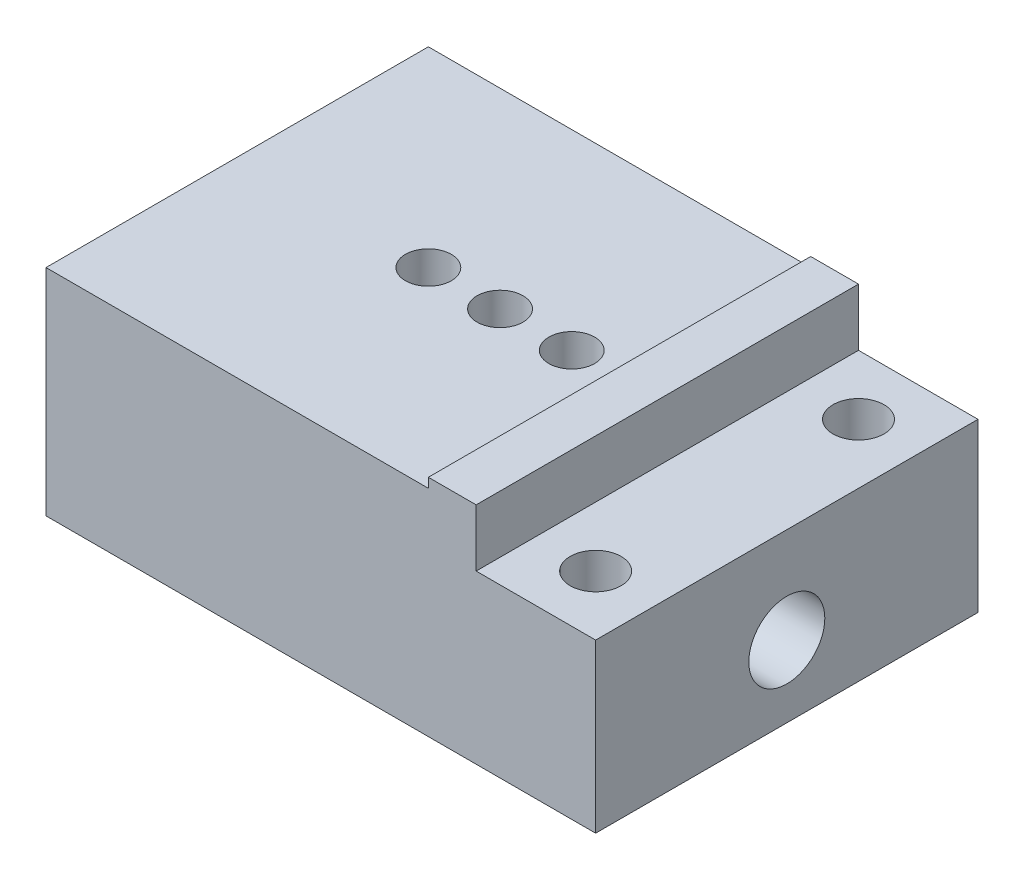
ISO-10303-21;
HEADER;
FILE_DESCRIPTION(('STEP AP214'),'2;1');
FILE_NAME('part.step','',(''),(''),'','','');
FILE_SCHEMA(('AUTOMOTIVE_DESIGN { 1 0 10303 214 1 1 1 1 }'));
ENDSEC;
DATA;
#1=APPLICATION_CONTEXT('core data for automotive mechanical design processes');
#2=APPLICATION_PROTOCOL_DEFINITION('international standard','automotive_design',2000,#1);
#3=PRODUCT_CONTEXT('',#1,'mechanical');
#4=PRODUCT('Part','Part','',(#3));
#5=PRODUCT_RELATED_PRODUCT_CATEGORY('part','',(#4));
#6=PRODUCT_DEFINITION_FORMATION('','',#4);
#7=PRODUCT_DEFINITION_CONTEXT('part definition',#1,'design');
#8=PRODUCT_DEFINITION('design','',#6,#7);
#9=PRODUCT_DEFINITION_SHAPE('','',#8);
#10=(LENGTH_UNIT() NAMED_UNIT(*) SI_UNIT(.MILLI.,.METRE.));
#11=(NAMED_UNIT(*) PLANE_ANGLE_UNIT() SI_UNIT($,.RADIAN.));
#12=(NAMED_UNIT(*) SI_UNIT($,.STERADIAN.) SOLID_ANGLE_UNIT());
#13=UNCERTAINTY_MEASURE_WITH_UNIT(LENGTH_MEASURE(1.E-05),#10,'distance_accuracy_value','');
#14=(GEOMETRIC_REPRESENTATION_CONTEXT(3) GLOBAL_UNCERTAINTY_ASSIGNED_CONTEXT((#13)) GLOBAL_UNIT_ASSIGNED_CONTEXT((#10,
#11,#12)) REPRESENTATION_CONTEXT('',''));
#15=CARTESIAN_POINT('',(0.,0.,0.));
#16=DIRECTION('',(0.,0.,1.));
#17=DIRECTION('',(1.,0.,0.));
#18=AXIS2_PLACEMENT_3D('',#15,#16,#17);
#19=CARTESIAN_POINT('',(0.,0.,20.32));
#20=DIRECTION('',(-1.,0.,0.));
#21=DIRECTION('',(0.,0.,1.));
#22=AXIS2_PLACEMENT_3D('',#19,#20,#21);
#23=PLANE('',#22);
#24=CARTESIAN_POINT('',(0.,9.652,6.35));
#25=DIRECTION('',(-1.,0.,0.));
#26=DIRECTION('',(0.,0.,1.));
#27=AXIS2_PLACEMENT_3D('',#24,#25,#26);
#28=CIRCLE('',#27,0.992250999999998);
#29=CARTESIAN_POINT('',(0.,9.652,7.342251));
#30=VERTEX_POINT('',#29);
#31=EDGE_CURVE('E280',#30,#30,#28,.T.);
#32=ORIENTED_EDGE('',*,*,#31,.F.);
#33=EDGE_LOOP('',(#32));
#34=FACE_BOUND('',#33,.T.);
#35=DIRECTION('',(0.,1.,0.));
#36=VECTOR('',#35,1.);
#37=CARTESIAN_POINT('',(0.,0.,0.));
#38=LINE('',#37,#36);
#39=CARTESIAN_POINT('',(0.,0.,0.));
#40=VERTEX_POINT('',#39);
#41=CARTESIAN_POINT('',(0.,11.43,0.));
#42=VERTEX_POINT('',#41);
#43=EDGE_CURVE('E149',#40,#42,#38,.T.);
#44=ORIENTED_EDGE('',*,*,#43,.F.);
#45=DIRECTION('',(0.,0.,-1.));
#46=VECTOR('',#45,1.);
#47=CARTESIAN_POINT('',(0.,0.,20.32));
#48=LINE('',#47,#46);
#49=CARTESIAN_POINT('',(0.,0.,20.32));
#50=VERTEX_POINT('',#49);
#51=EDGE_CURVE('E11',#50,#40,#48,.T.);
#52=ORIENTED_EDGE('',*,*,#51,.F.);
#53=DIRECTION('',(0.,1.,0.));
#54=VECTOR('',#53,1.);
#55=CARTESIAN_POINT('',(0.,0.,20.32));
#56=LINE('',#55,#54);
#57=CARTESIAN_POINT('',(0.,11.43,20.32));
#58=VERTEX_POINT('',#57);
#59=EDGE_CURVE('E174',#50,#58,#56,.T.);
#60=ORIENTED_EDGE('',*,*,#59,.T.);
#61=DIRECTION('',(0.,0.,-1.));
#62=VECTOR('',#61,1.);
#63=CARTESIAN_POINT('',(0.,11.43,20.32));
#64=LINE('',#63,#62);
#65=EDGE_CURVE('E98',#58,#42,#64,.T.);
#66=ORIENTED_EDGE('',*,*,#65,.T.);
#67=EDGE_LOOP('',(#44,#52,#60,#66));
#68=FACE_BOUND('',#67,.T.);
#69=ADVANCED_FACE('F39',(#34,#68),#23,.T.);
#70=CARTESIAN_POINT('',(0.,0.,20.32));
#71=DIRECTION('',(0.,1.,0.));
#72=DIRECTION('',(0.,0.,1.));
#73=AXIS2_PLACEMENT_3D('',#70,#71,#72);
#74=PLANE('',#73);
#75=CARTESIAN_POINT('',(26.035,0.,17.145));
#76=DIRECTION('',(0.,1.,0.));
#77=DIRECTION('',(0.,0.,1.));
#78=AXIS2_PLACEMENT_3D('',#75,#76,#77);
#79=CIRCLE('',#78,1.35255);
#80=CARTESIAN_POINT('',(26.035,0.,18.49755));
#81=VERTEX_POINT('',#80);
#82=EDGE_CURVE('E435',#81,#81,#79,.T.);
#83=ORIENTED_EDGE('',*,*,#82,.T.);
#84=EDGE_LOOP('',(#83));
#85=FACE_BOUND('',#84,.T.);
#86=CARTESIAN_POINT('',(26.035,0.,3.175));
#87=DIRECTION('',(0.,1.,0.));
#88=DIRECTION('',(0.,0.,1.));
#89=AXIS2_PLACEMENT_3D('',#86,#87,#88);
#90=CIRCLE('',#89,1.35255);
#91=CARTESIAN_POINT('',(26.035,0.,4.52755));
#92=VERTEX_POINT('',#91);
#93=EDGE_CURVE('E284',#92,#92,#90,.T.);
#94=ORIENTED_EDGE('',*,*,#93,.T.);
#95=EDGE_LOOP('',(#94));
#96=FACE_BOUND('',#95,.T.);
#97=DIRECTION('',(1.,0.,0.));
#98=VECTOR('',#97,1.);
#99=CARTESIAN_POINT('',(0.,0.,0.));
#100=LINE('',#99,#98);
#101=CARTESIAN_POINT('',(29.21,0.,0.));
#102=VERTEX_POINT('',#101);
#103=EDGE_CURVE('E89',#40,#102,#100,.T.);
#104=ORIENTED_EDGE('',*,*,#103,.T.);
#105=DIRECTION('',(0.,0.,-1.));
#106=VECTOR('',#105,1.);
#107=CARTESIAN_POINT('',(29.21,0.,20.32));
#108=LINE('',#107,#106);
#109=CARTESIAN_POINT('',(29.21,0.,20.32));
#110=VERTEX_POINT('',#109);
#111=EDGE_CURVE('E54',#110,#102,#108,.T.);
#112=ORIENTED_EDGE('',*,*,#111,.F.);
#113=DIRECTION('',(-1.,0.,0.));
#114=VECTOR('',#113,1.);
#115=CARTESIAN_POINT('',(29.21,0.,20.32));
#116=LINE('',#115,#114);
#117=EDGE_CURVE('E62',#110,#50,#116,.T.);
#118=ORIENTED_EDGE('',*,*,#117,.T.);
#119=ORIENTED_EDGE('',*,*,#51,.T.);
#120=EDGE_LOOP('',(#104,#112,#118,#119));
#121=FACE_BOUND('',#120,.T.);
#122=ADVANCED_FACE('F271',(#85,#96,#121),#74,.F.);
#123=CARTESIAN_POINT('',(29.21,0.,20.32));
#124=DIRECTION('',(-1.,0.,0.));
#125=DIRECTION('',(0.,-1.,0.));
#126=AXIS2_PLACEMENT_3D('',#123,#124,#125);
#127=PLANE('',#126);
#128=CARTESIAN_POINT('',(29.21,3.81,10.16));
#129=DIRECTION('',(1.,0.,0.));
#130=DIRECTION('',(0.,0.,-1.));
#131=AXIS2_PLACEMENT_3D('',#128,#129,#130);
#132=CIRCLE('',#131,2.0193);
#133=CARTESIAN_POINT('',(29.21,3.81,8.1407));
#134=VERTEX_POINT('',#133);
#135=EDGE_CURVE('E289',#134,#134,#132,.T.);
#136=ORIENTED_EDGE('',*,*,#135,.F.);
#137=EDGE_LOOP('',(#136));
#138=FACE_BOUND('',#137,.T.);
#139=DIRECTION('',(0.,1.,0.));
#140=VECTOR('',#139,1.);
#141=CARTESIAN_POINT('',(29.21,0.,0.));
#142=LINE('',#141,#140);
#143=CARTESIAN_POINT('',(29.21,8.89,0.));
#144=VERTEX_POINT('',#143);
#145=EDGE_CURVE('E130',#102,#144,#142,.T.);
#146=ORIENTED_EDGE('',*,*,#145,.T.);
#147=DIRECTION('',(0.,0.,-1.));
#148=VECTOR('',#147,1.);
#149=CARTESIAN_POINT('',(29.21,8.89,20.32));
#150=LINE('',#149,#148);
#151=CARTESIAN_POINT('',(29.21,8.89,20.32));
#152=VERTEX_POINT('',#151);
#153=EDGE_CURVE('E127',#152,#144,#150,.T.);
#154=ORIENTED_EDGE('',*,*,#153,.F.);
#155=DIRECTION('',(0.,1.,0.));
#156=VECTOR('',#155,1.);
#157=CARTESIAN_POINT('',(29.21,0.,20.32));
#158=LINE('',#157,#156);
#159=EDGE_CURVE('E117',#110,#152,#158,.T.);
#160=ORIENTED_EDGE('',*,*,#159,.F.);
#161=ORIENTED_EDGE('',*,*,#111,.T.);
#162=EDGE_LOOP('',(#146,#154,#160,#161));
#163=FACE_BOUND('',#162,.T.);
#164=ADVANCED_FACE('F128',(#138,#163),#127,.F.);
#165=CARTESIAN_POINT('',(22.86,8.89,20.32));
#166=DIRECTION('',(0.,1.,0.));
#167=DIRECTION('',(0.,0.,1.));
#168=AXIS2_PLACEMENT_3D('',#165,#166,#167);
#169=PLANE('',#168);
#170=CARTESIAN_POINT('',(26.035,8.89,17.145));
#171=DIRECTION('',(0.,1.,0.));
#172=DIRECTION('',(0.,0.,1.));
#173=AXIS2_PLACEMENT_3D('',#170,#171,#172);
#174=CIRCLE('',#173,1.35254999999999);
#175=CARTESIAN_POINT('',(26.035,8.89,18.49755));
#176=VERTEX_POINT('',#175);
#177=EDGE_CURVE('E438',#176,#176,#174,.T.);
#178=ORIENTED_EDGE('',*,*,#177,.F.);
#179=EDGE_LOOP('',(#178));
#180=FACE_BOUND('',#179,.T.);
#181=CARTESIAN_POINT('',(26.035,8.89,3.175));
#182=DIRECTION('',(0.,1.,0.));
#183=DIRECTION('',(0.,0.,1.));
#184=AXIS2_PLACEMENT_3D('',#181,#182,#183);
#185=CIRCLE('',#184,1.35254999999999);
#186=CARTESIAN_POINT('',(26.035,8.89,4.52754999999999));
#187=VERTEX_POINT('',#186);
#188=EDGE_CURVE('E292',#187,#187,#185,.T.);
#189=ORIENTED_EDGE('',*,*,#188,.F.);
#190=EDGE_LOOP('',(#189));
#191=FACE_BOUND('',#190,.T.);
#192=DIRECTION('',(1.,0.,0.));
#193=VECTOR('',#192,1.);
#194=CARTESIAN_POINT('',(22.86,8.89,0.));
#195=LINE('',#194,#193);
#196=CARTESIAN_POINT('',(22.86,8.89,0.));
#197=VERTEX_POINT('',#196);
#198=EDGE_CURVE('E168',#197,#144,#195,.T.);
#199=ORIENTED_EDGE('',*,*,#198,.F.);
#200=DIRECTION('',(0.,0.,-1.));
#201=VECTOR('',#200,1.);
#202=CARTESIAN_POINT('',(22.86,8.89,20.32));
#203=LINE('',#202,#201);
#204=CARTESIAN_POINT('',(22.86,8.89,20.32));
#205=VERTEX_POINT('',#204);
#206=EDGE_CURVE('E135',#205,#197,#203,.T.);
#207=ORIENTED_EDGE('',*,*,#206,.F.);
#208=DIRECTION('',(1.,0.,0.));
#209=VECTOR('',#208,1.);
#210=CARTESIAN_POINT('',(22.86,8.89,20.32));
#211=LINE('',#210,#209);
#212=EDGE_CURVE('E122',#205,#152,#211,.T.);
#213=ORIENTED_EDGE('',*,*,#212,.T.);
#214=ORIENTED_EDGE('',*,*,#153,.T.);
#215=EDGE_LOOP('',(#199,#207,#213,#214));
#216=FACE_BOUND('',#215,.T.);
#217=ADVANCED_FACE('F137',(#180,#191,#216),#169,.T.);
#218=CARTESIAN_POINT('',(22.86,8.89,20.32));
#219=DIRECTION('',(-1.,0.,0.));
#220=DIRECTION('',(0.,0.,1.));
#221=AXIS2_PLACEMENT_3D('',#218,#219,#220);
#222=PLANE('',#221);
#223=DIRECTION('',(0.,1.,0.));
#224=VECTOR('',#223,1.);
#225=CARTESIAN_POINT('',(22.86,8.89,0.));
#226=LINE('',#225,#224);
#227=CARTESIAN_POINT('',(22.86,11.938,0.));
#228=VERTEX_POINT('',#227);
#229=EDGE_CURVE('E165',#197,#228,#226,.T.);
#230=ORIENTED_EDGE('',*,*,#229,.T.);
#231=DIRECTION('',(0.,0.,-1.));
#232=VECTOR('',#231,1.);
#233=CARTESIAN_POINT('',(22.86,11.938,20.32));
#234=LINE('',#233,#232);
#235=CARTESIAN_POINT('',(22.86,11.938,20.32));
#236=VERTEX_POINT('',#235);
#237=EDGE_CURVE('E180',#236,#228,#234,.T.);
#238=ORIENTED_EDGE('',*,*,#237,.F.);
#239=DIRECTION('',(0.,1.,0.));
#240=VECTOR('',#239,1.);
#241=CARTESIAN_POINT('',(22.86,8.89,20.32));
#242=LINE('',#241,#240);
#243=EDGE_CURVE('E140',#205,#236,#242,.T.);
#244=ORIENTED_EDGE('',*,*,#243,.F.);
#245=ORIENTED_EDGE('',*,*,#206,.T.);
#246=EDGE_LOOP('',(#230,#238,#244,#245));
#247=FACE_BOUND('',#246,.T.);
#248=ADVANCED_FACE('F203',(#247),#222,.F.);
#249=CARTESIAN_POINT('',(22.86,11.938,20.32));
#250=DIRECTION('',(0.,-1.,0.));
#251=DIRECTION('',(0.,0.,-1.));
#252=AXIS2_PLACEMENT_3D('',#249,#250,#251);
#253=PLANE('',#252);
#254=DIRECTION('',(-1.,0.,0.));
#255=VECTOR('',#254,1.);
#256=CARTESIAN_POINT('',(22.86,11.938,0.));
#257=LINE('',#256,#255);
#258=CARTESIAN_POINT('',(20.32,11.938,0.));
#259=VERTEX_POINT('',#258);
#260=EDGE_CURVE('E162',#228,#259,#257,.T.);
#261=ORIENTED_EDGE('',*,*,#260,.T.);
#262=DIRECTION('',(0.,0.,-1.));
#263=VECTOR('',#262,1.);
#264=CARTESIAN_POINT('',(20.32,11.938,20.32));
#265=LINE('',#264,#263);
#266=CARTESIAN_POINT('',(20.32,11.938,20.32));
#267=VERTEX_POINT('',#266);
#268=EDGE_CURVE('E184',#267,#259,#265,.T.);
#269=ORIENTED_EDGE('',*,*,#268,.F.);
#270=DIRECTION('',(-1.,0.,0.));
#271=VECTOR('',#270,1.);
#272=CARTESIAN_POINT('',(22.86,11.938,20.32));
#273=LINE('',#272,#271);
#274=EDGE_CURVE('E143',#236,#267,#273,.T.);
#275=ORIENTED_EDGE('',*,*,#274,.F.);
#276=ORIENTED_EDGE('',*,*,#237,.T.);
#277=EDGE_LOOP('',(#261,#269,#275,#276));
#278=FACE_BOUND('',#277,.T.);
#279=ADVANCED_FACE('F206',(#278),#253,.F.);
#280=CARTESIAN_POINT('',(20.32,11.938,20.32));
#281=DIRECTION('',(1.,0.,0.));
#282=DIRECTION('',(0.,0.,-1.));
#283=AXIS2_PLACEMENT_3D('',#280,#281,#282);
#284=PLANE('',#283);
#285=DIRECTION('',(0.,-1.,0.));
#286=VECTOR('',#285,1.);
#287=CARTESIAN_POINT('',(20.32,11.938,0.));
#288=LINE('',#287,#286);
#289=CARTESIAN_POINT('',(20.32,11.43,0.));
#290=VERTEX_POINT('',#289);
#291=EDGE_CURVE('E158',#259,#290,#288,.T.);
#292=ORIENTED_EDGE('',*,*,#291,.T.);
#293=DIRECTION('',(0.,0.,-1.));
#294=VECTOR('',#293,1.);
#295=CARTESIAN_POINT('',(20.32,11.43,20.32));
#296=LINE('',#295,#294);
#297=CARTESIAN_POINT('',(20.32,11.43,20.32));
#298=VERTEX_POINT('',#297);
#299=EDGE_CURVE('E188',#298,#290,#296,.T.);
#300=ORIENTED_EDGE('',*,*,#299,.F.);
#301=DIRECTION('',(0.,-1.,0.));
#302=VECTOR('',#301,1.);
#303=CARTESIAN_POINT('',(20.32,11.938,20.32));
#304=LINE('',#303,#302);
#305=EDGE_CURVE('E210',#267,#298,#304,.T.);
#306=ORIENTED_EDGE('',*,*,#305,.F.);
#307=ORIENTED_EDGE('',*,*,#268,.T.);
#308=EDGE_LOOP('',(#292,#300,#306,#307));
#309=FACE_BOUND('',#308,.T.);
#310=ADVANCED_FACE('F320',(#309),#284,.F.);
#311=CARTESIAN_POINT('',(0.,11.43,20.32));
#312=DIRECTION('',(0.,1.,0.));
#313=DIRECTION('',(0.,0.,1.));
#314=AXIS2_PLACEMENT_3D('',#311,#312,#313);
#315=PLANE('',#314);
#316=CARTESIAN_POINT('',(17.78,11.43,10.16));
#317=DIRECTION('',(0.,1.,0.));
#318=DIRECTION('',(0.,0.,1.));
#319=AXIS2_PLACEMENT_3D('',#316,#317,#318);
#320=CIRCLE('',#319,1.21919999999999);
#321=CARTESIAN_POINT('',(17.78,11.43,11.3792));
#322=VERTEX_POINT('',#321);
#323=EDGE_CURVE('E226',#322,#322,#320,.T.);
#324=ORIENTED_EDGE('',*,*,#323,.F.);
#325=EDGE_LOOP('',(#324));
#326=FACE_BOUND('',#325,.T.);
#327=CARTESIAN_POINT('',(13.97,11.43,10.16));
#328=DIRECTION('',(0.,1.,0.));
#329=DIRECTION('',(0.,0.,1.));
#330=AXIS2_PLACEMENT_3D('',#327,#328,#329);
#331=CIRCLE('',#330,1.21919999999999);
#332=CARTESIAN_POINT('',(13.97,11.43,11.3792));
#333=VERTEX_POINT('',#332);
#334=EDGE_CURVE('E222',#333,#333,#331,.T.);
#335=ORIENTED_EDGE('',*,*,#334,.F.);
#336=EDGE_LOOP('',(#335));
#337=FACE_BOUND('',#336,.T.);
#338=CARTESIAN_POINT('',(10.16,11.43,10.16));
#339=DIRECTION('',(0.,1.,0.));
#340=DIRECTION('',(0.,0.,1.));
#341=AXIS2_PLACEMENT_3D('',#338,#339,#340);
#342=CIRCLE('',#341,1.21919999999999);
#343=CARTESIAN_POINT('',(10.16,11.43,11.3792));
#344=VERTEX_POINT('',#343);
#345=EDGE_CURVE('E154',#344,#344,#342,.T.);
#346=ORIENTED_EDGE('',*,*,#345,.F.);
#347=EDGE_LOOP('',(#346));
#348=FACE_BOUND('',#347,.T.);
#349=DIRECTION('',(1.,0.,0.));
#350=VECTOR('',#349,1.);
#351=CARTESIAN_POINT('',(0.,11.43,0.));
#352=LINE('',#351,#350);
#353=EDGE_CURVE('E153',#42,#290,#352,.T.);
#354=ORIENTED_EDGE('',*,*,#353,.F.);
#355=ORIENTED_EDGE('',*,*,#65,.F.);
#356=DIRECTION('',(1.,0.,0.));
#357=VECTOR('',#356,1.);
#358=CARTESIAN_POINT('',(0.,11.43,20.32));
#359=LINE('',#358,#357);
#360=EDGE_CURVE('E212',#58,#298,#359,.T.);
#361=ORIENTED_EDGE('',*,*,#360,.T.);
#362=ORIENTED_EDGE('',*,*,#299,.T.);
#363=EDGE_LOOP('',(#354,#355,#361,#362));
#364=FACE_BOUND('',#363,.T.);
#365=ADVANCED_FACE('F194',(#326,#337,#348,#364),#315,.T.);
#366=CARTESIAN_POINT('',(0.,0.,20.32));
#367=DIRECTION('',(0.,0.,-1.));
#368=DIRECTION('',(-1.,0.,0.));
#369=AXIS2_PLACEMENT_3D('',#366,#367,#368);
#370=PLANE('',#369);
#371=ORIENTED_EDGE('',*,*,#59,.F.);
#372=ORIENTED_EDGE('',*,*,#117,.F.);
#373=ORIENTED_EDGE('',*,*,#159,.T.);
#374=ORIENTED_EDGE('',*,*,#212,.F.);
#375=ORIENTED_EDGE('',*,*,#243,.T.);
#376=ORIENTED_EDGE('',*,*,#274,.T.);
#377=ORIENTED_EDGE('',*,*,#305,.T.);
#378=ORIENTED_EDGE('',*,*,#360,.F.);
#379=EDGE_LOOP('',(#371,#372,#373,#374,#375,#376,#377,#378));
#380=FACE_BOUND('',#379,.T.);
#381=ADVANCED_FACE('F120',(#380),#370,.F.);
#382=CARTESIAN_POINT('',(0.,0.,0.));
#383=DIRECTION('',(0.,0.,-1.));
#384=DIRECTION('',(-1.,0.,0.));
#385=AXIS2_PLACEMENT_3D('',#382,#383,#384);
#386=PLANE('',#385);
#387=ORIENTED_EDGE('',*,*,#43,.T.);
#388=ORIENTED_EDGE('',*,*,#353,.T.);
#389=ORIENTED_EDGE('',*,*,#291,.F.);
#390=ORIENTED_EDGE('',*,*,#260,.F.);
#391=ORIENTED_EDGE('',*,*,#229,.F.);
#392=ORIENTED_EDGE('',*,*,#198,.T.);
#393=ORIENTED_EDGE('',*,*,#145,.F.);
#394=ORIENTED_EDGE('',*,*,#103,.F.);
#395=EDGE_LOOP('',(#387,#388,#389,#390,#391,#392,#393,#394));
#396=FACE_BOUND('',#395,.T.);
#397=ADVANCED_FACE('F198',(#396),#386,.T.);
#398=CARTESIAN_POINT('',(10.16,11.43,10.16));
#399=DIRECTION('',(0.,1.,0.));
#400=DIRECTION('',(0.,0.,1.));
#401=AXIS2_PLACEMENT_3D('',#398,#399,#400);
#402=CYLINDRICAL_SURFACE('',#401,1.21919999999999);
#403=CARTESIAN_POINT('',(10.16,5.41969681927995,11.3792));
#404=CARTESIAN_POINT('',(10.0988764016193,5.41970907777103,11.3791914921849));
#405=CARTESIAN_POINT('',(10.037652944585,5.42324258414726,11.3745621777342));
#406=CARTESIAN_POINT('',(9.91720011378757,5.43679251943422,11.3563427176007));
#407=CARTESIAN_POINT('',(9.85797755137548,5.4468291239094,11.3427246823544));
#408=CARTESIAN_POINT('',(9.74364815140275,5.4717397968624,11.3074540969637));
#409=CARTESIAN_POINT('',(9.68851198295162,5.48657421473255,11.285867203941));
#410=CARTESIAN_POINT('',(9.58270973949775,5.51934239333989,11.2354639123584));
#411=CARTESIAN_POINT('',(9.53204319928234,5.53727583094528,11.2066482673921));
#412=CARTESIAN_POINT('',(9.42968529226489,5.57691448506079,11.1384306676681));
#413=CARTESIAN_POINT('',(9.37864795547997,5.59881153653828,11.0981584672594));
#414=CARTESIAN_POINT('',(9.28350436807428,5.6423698069414,11.0099510501724));
#415=CARTESIAN_POINT('',(9.23940392309651,5.66403081435503,10.9620094817902));
#416=CARTESIAN_POINT('',(9.15459853366255,5.70749520143868,10.8534431372873));
#417=CARTESIAN_POINT('',(9.11479811673978,5.72905305884484,10.792003726329));
#418=CARTESIAN_POINT('',(9.04640764229254,5.7671419795584,10.6617519844634));
#419=CARTESIAN_POINT('',(9.01780711506077,5.78367773428836,10.5929466162898));
#420=CARTESIAN_POINT('',(8.97557695534709,5.80842923576698,10.4569197916554));
#421=CARTESIAN_POINT('',(8.96077007842007,5.8172932749561,10.3901848463013));
#422=CARTESIAN_POINT('',(8.9425635438174,5.82822182111385,10.2546508058811));
#423=CARTESIAN_POINT('',(8.93915297115002,5.83029283417636,10.1858537496071));
#424=CARTESIAN_POINT('',(8.94363833573355,5.8275878496804,10.0574656932595));
#425=CARTESIAN_POINT('',(8.95016887472245,5.8236386229745,9.99780301865066));
#426=CARTESIAN_POINT('',(8.97175014019517,5.81074648698702,9.88060650476243));
#427=CARTESIAN_POINT('',(8.9868015087286,5.80180320140079,9.82307282625221));
#428=CARTESIAN_POINT('',(9.02484419990187,5.779635292002,9.71124583698852));
#429=CARTESIAN_POINT('',(9.04787755107758,5.76638802945363,9.65697149933878));
#430=CARTESIAN_POINT('',(9.10103504823734,5.73666694079979,9.5529951406244));
#431=CARTESIAN_POINT('',(9.1311609983329,5.72019229393887,9.50329428737695));
#432=CARTESIAN_POINT('',(9.20172947376919,5.68307184367006,9.40346878845286));
#433=CARTESIAN_POINT('',(9.24297690623504,5.66216268569383,9.35401171683239));
#434=CARTESIAN_POINT('',(9.33253808405035,5.61949313601556,9.26229622572366));
#435=CARTESIAN_POINT('',(9.38086151308184,5.59773160820667,9.22004784587363));
#436=CARTESIAN_POINT('',(9.48995340733252,5.55279251703733,9.1389026499164));
#437=CARTESIAN_POINT('',(9.55151762054456,5.52975118906742,9.10099073085838));
#438=CARTESIAN_POINT('',(9.68158282187444,5.48816669393843,9.03624863416109));
#439=CARTESIAN_POINT('',(9.75007070831784,5.46961524835911,9.0093979965825));
#440=CARTESIAN_POINT('',(9.87451018469491,5.44398459152344,8.97339668993221));
#441=CARTESIAN_POINT('',(9.92931427620631,5.43519667785282,8.96149898107911));
#442=CARTESIAN_POINT('',(10.0406117822383,5.42317438387262,8.94536140112447));
#443=CARTESIAN_POINT('',(10.0971031006215,5.41993338227001,8.94111239952381));
#444=CARTESIAN_POINT('',(10.2102353824101,5.41948515300746,8.94052047160422));
#445=CARTESIAN_POINT('',(10.2668764430293,5.4222870275714,8.94418947196659));
#446=CARTESIAN_POINT('',(10.3785682938152,5.4335142120423,8.95922610140932));
#447=CARTESIAN_POINT('',(10.4336177792738,5.44194400633911,8.97059986984177));
#448=CARTESIAN_POINT('',(10.5406158621592,5.46325265200992,9.0004061090763));
#449=CARTESIAN_POINT('',(10.5925742316787,5.47611650128835,9.01881480059344));
#450=CARTESIAN_POINT('',(10.6928266396577,5.50490927115241,9.06203452993931));
#451=CARTESIAN_POINT('',(10.741119301541,5.52083933532541,9.08684795768438));
#452=CARTESIAN_POINT('',(10.8419856601817,5.55746473500179,9.14737719176584));
#453=CARTESIAN_POINT('',(10.8937394203436,5.57849972602677,9.18425523203766));
#454=CARTESIAN_POINT('',(10.9908666832662,5.62095381657792,9.26550352452219));
#455=CARTESIAN_POINT('',(11.0362339080546,5.64237327103814,9.30988105576957));
#456=CARTESIAN_POINT('',(11.1254588663499,5.68657586083284,9.41198433375449));
#457=CARTESIAN_POINT('',(11.1682946916147,5.70915551244134,9.47070242646818));
#458=CARTESIAN_POINT('',(11.2433277943871,5.75003450941427,9.59593810804681));
#459=CARTESIAN_POINT('',(11.2755318736678,5.76833658920332,9.66245067326066));
#460=CARTESIAN_POINT('',(11.3258184106101,5.79742723006486,9.79658258608297));
#461=CARTESIAN_POINT('',(11.3447419403213,5.80865739043646,9.86378720226223));
#462=CARTESIAN_POINT('',(11.3708269684505,5.82422758274169,10.001191702597));
#463=CARTESIAN_POINT('',(11.3780022024244,5.82857566068455,10.0713879903239));
#464=CARTESIAN_POINT('',(11.3799789503579,5.82977130137812,10.2024540644318));
#465=CARTESIAN_POINT('',(11.3763256275746,5.8275555117422,10.2632985255126));
#466=CARTESIAN_POINT('',(11.360097476544,5.81781354192864,10.383341860785));
#467=CARTESIAN_POINT('',(11.3475226125885,5.81028734049624,10.4425407283894));
#468=CARTESIAN_POINT('',(11.3143845328538,5.79079597459578,10.5566253516878));
#469=CARTESIAN_POINT('',(11.2939745021122,5.77891611883946,10.6115709134988));
#470=CARTESIAN_POINT('',(11.2459483118963,5.75165323874264,10.7172587357444));
#471=CARTESIAN_POINT('',(11.2183306428675,5.73626948063731,10.7680001127259));
#472=CARTESIAN_POINT('',(11.1533399177356,5.70130032402013,10.8697559482748));
#473=CARTESIAN_POINT('',(11.1152352595688,5.68144054909638,10.920207621292));
#474=CARTESIAN_POINT('',(11.0320200668496,5.64036406877654,11.0143921880069));
#475=CARTESIAN_POINT('',(10.9869014094835,5.61914580710721,11.0581171733159));
#476=CARTESIAN_POINT('',(10.8841045428639,5.57437925311783,11.1434359244301));
#477=CARTESIAN_POINT('',(10.8255563056944,5.550885855587,11.1840170282847));
#478=CARTESIAN_POINT('',(10.7013040648296,5.50728332613668,11.2547757007503));
#479=CARTESIAN_POINT('',(10.6356058537435,5.48717148774946,11.2849616097482));
#480=CARTESIAN_POINT('',(10.5137415701826,5.45729728930714,11.3281235810531));
#481=CARTESIAN_POINT('',(10.4587241624801,5.44622663626535,11.3434376878641));
#482=CARTESIAN_POINT('',(10.3463871861003,5.42951109954243,11.3662195444412));
#483=CARTESIAN_POINT('',(10.2890759854201,5.42384808700498,11.3737135187261));
#484=CARTESIAN_POINT('',(10.207682759667,5.42022331953477,11.3785031787494));
#485=CARTESIAN_POINT('',(10.1838489809526,5.41969203630696,11.379203319548));
#486=CARTESIAN_POINT('',(10.16,5.41969681927995,11.3792));
#487=B_SPLINE_CURVE_WITH_KNOTS('',3,(#403,#404,#405,#406,#407,#408,#409,#410,#411,#412,#413,
#414,#415,#416,#417,#418,#419,#420,#421,#422,#423,#424,#425,#426,#427,#428,#429,#430,#431,#432,
#433,#434,#435,#436,#437,#438,#439,#440,#441,#442,#443,#444,#445,#446,#447,#448,#449,#450,#451,
#452,#453,#454,#455,#456,#457,#458,#459,#460,#461,#462,#463,#464,#465,#466,#467,#468,#469,#470,
#471,#472,#473,#474,#475,#476,#477,#478,#479,#480,#481,#482,#483,#484,#485,#486),.UNSPECIFIED.,
.T.,.F.,(4,2,2,2,2,2,2,2,2,2,2,2,2,2,2,2,2,2,2,2,2,2,2,2,2,2,2,2,2,2,2,2,2,2,2,2,2,2,2,2,2,4),
(0.,0.183286010793251,0.36714339855955,0.549518578254764,0.731874753327448,0.936875616324574,
1.14204714668978,1.36974690084286,1.59723328920109,1.80279398882128,2.00815775289302,
2.18774544362103,2.36734666819095,2.54790831115303,2.72851593246008,2.93083939020028,
3.13344236633102,3.35996991851076,3.58607656299594,3.75564530253104,3.92501148802993,
4.09463296346821,4.26438975677593,4.43357774610463,4.60282895913988,4.80287674899918,
5.00311983308412,5.23026898388266,5.45727253069356,5.66814033255404,5.87876142117827,
6.06083803509551,6.24291537777261,6.42160067126445,6.6003234183484,6.7983554274821,
6.99661850705734,7.22060656483125,7.44441448904066,7.61823154711336,7.79146382453865,
7.86297768655089),.UNSPECIFIED.);
#488=CARTESIAN_POINT('',(10.16,5.41969681927995,11.3792));
#489=VERTEX_POINT('',#488);
#490=EDGE_CURVE('E42',#489,#489,#487,.T.);
#491=ORIENTED_EDGE('',*,*,#490,.T.);
#492=EDGE_LOOP('',(#491));
#493=FACE_BOUND('',#492,.T.);
#494=ORIENTED_EDGE('',*,*,#345,.T.);
#495=EDGE_LOOP('',(#494));
#496=FACE_BOUND('',#495,.T.);
#497=ADVANCED_FACE('F266',(#493,#496),#402,.F.);
#498=CARTESIAN_POINT('',(13.97,11.43,10.16));
#499=DIRECTION('',(0.,1.,0.));
#500=DIRECTION('',(0.,0.,1.));
#501=AXIS2_PLACEMENT_3D('',#498,#499,#500);
#502=CYLINDRICAL_SURFACE('',#501,1.21919999999999);
#503=CARTESIAN_POINT('',(13.97,5.41969681927995,11.3792));
#504=CARTESIAN_POINT('',(13.9088764016193,5.41970907777103,11.3791914921849));
#505=CARTESIAN_POINT('',(13.847652944585,5.42324258414726,11.3745621777342));
#506=CARTESIAN_POINT('',(13.7272001137876,5.43679251943422,11.3563427176007));
#507=CARTESIAN_POINT('',(13.6679775513755,5.4468291239094,11.3427246823544));
#508=CARTESIAN_POINT('',(13.5536481514027,5.4717397968624,11.3074540969637));
#509=CARTESIAN_POINT('',(13.4985119829516,5.48657421473255,11.285867203941));
#510=CARTESIAN_POINT('',(13.3927097394978,5.51934239333989,11.2354639123584));
#511=CARTESIAN_POINT('',(13.3420431992823,5.53727583094528,11.2066482673921));
#512=CARTESIAN_POINT('',(13.2396852922649,5.57691448506079,11.1384306676681));
#513=CARTESIAN_POINT('',(13.18864795548,5.59881153653828,11.0981584672594));
#514=CARTESIAN_POINT('',(13.0935043680743,5.6423698069414,11.0099510501724));
#515=CARTESIAN_POINT('',(13.0494039230965,5.66403081435503,10.9620094817902));
#516=CARTESIAN_POINT('',(12.9645985336625,5.70749520143868,10.8534431372873));
#517=CARTESIAN_POINT('',(12.9247981167398,5.72905305884484,10.792003726329));
#518=CARTESIAN_POINT('',(12.8564076422925,5.7671419795584,10.6617519844634));
#519=CARTESIAN_POINT('',(12.8278071150608,5.78367773428836,10.5929466162898));
#520=CARTESIAN_POINT('',(12.7855769553471,5.80842923576698,10.4569197916554));
#521=CARTESIAN_POINT('',(12.7707700784201,5.8172932749561,10.3901848463013));
#522=CARTESIAN_POINT('',(12.7525635438174,5.82822182111385,10.2546508058811));
#523=CARTESIAN_POINT('',(12.74915297115,5.83029283417636,10.1858537496071));
#524=CARTESIAN_POINT('',(12.7536383357335,5.8275878496804,10.0574656932595));
#525=CARTESIAN_POINT('',(12.7601688747225,5.8236386229745,9.99780301865066));
#526=CARTESIAN_POINT('',(12.7817501401952,5.81074648698702,9.88060650476243));
#527=CARTESIAN_POINT('',(12.7968015087286,5.80180320140079,9.82307282625221));
#528=CARTESIAN_POINT('',(12.8348441999019,5.779635292002,9.71124583698852));
#529=CARTESIAN_POINT('',(12.8578775510776,5.76638802945363,9.65697149933878));
#530=CARTESIAN_POINT('',(12.9110350482373,5.73666694079979,9.5529951406244));
#531=CARTESIAN_POINT('',(12.9411609983329,5.72019229393887,9.50329428737695));
#532=CARTESIAN_POINT('',(13.0117294737692,5.68307184367006,9.40346878845286));
#533=CARTESIAN_POINT('',(13.052976906235,5.66216268569383,9.35401171683239));
#534=CARTESIAN_POINT('',(13.1425380840504,5.61949313601556,9.26229622572366));
#535=CARTESIAN_POINT('',(13.1908615130818,5.59773160820667,9.22004784587363));
#536=CARTESIAN_POINT('',(13.2999534073325,5.55279251703733,9.1389026499164));
#537=CARTESIAN_POINT('',(13.3615176205446,5.52975118906742,9.10099073085838));
#538=CARTESIAN_POINT('',(13.4915828218744,5.48816669393843,9.03624863416109));
#539=CARTESIAN_POINT('',(13.5600707083178,5.46961524835911,9.0093979965825));
#540=CARTESIAN_POINT('',(13.6845101846949,5.44398459152344,8.97339668993221));
#541=CARTESIAN_POINT('',(13.7393142762063,5.43519667785282,8.96149898107911));
#542=CARTESIAN_POINT('',(13.8506117822383,5.42317438387262,8.94536140112447));
#543=CARTESIAN_POINT('',(13.9071031006215,5.41993338227001,8.94111239952381));
#544=CARTESIAN_POINT('',(14.0202353824101,5.41948515300746,8.94052047160422));
#545=CARTESIAN_POINT('',(14.0768764430293,5.4222870275714,8.94418947196659));
#546=CARTESIAN_POINT('',(14.1885682938152,5.4335142120423,8.95922610140932));
#547=CARTESIAN_POINT('',(14.2436177792738,5.44194400633911,8.97059986984177));
#548=CARTESIAN_POINT('',(14.3506158621592,5.46325265200992,9.0004061090763));
#549=CARTESIAN_POINT('',(14.4025742316787,5.47611650128835,9.01881480059344));
#550=CARTESIAN_POINT('',(14.5028266396577,5.50490927115241,9.06203452993931));
#551=CARTESIAN_POINT('',(14.551119301541,5.52083933532541,9.08684795768438));
#552=CARTESIAN_POINT('',(14.6519856601817,5.55746473500179,9.14737719176584));
#553=CARTESIAN_POINT('',(14.7037394203436,5.57849972602677,9.18425523203766));
#554=CARTESIAN_POINT('',(14.8008666832662,5.62095381657792,9.26550352452219));
#555=CARTESIAN_POINT('',(14.8462339080546,5.64237327103814,9.30988105576957));
#556=CARTESIAN_POINT('',(14.9354588663499,5.68657586083284,9.41198433375449));
#557=CARTESIAN_POINT('',(14.9782946916147,5.70915551244134,9.47070242646818));
#558=CARTESIAN_POINT('',(15.0533277943871,5.75003450941427,9.59593810804681));
#559=CARTESIAN_POINT('',(15.0855318736678,5.76833658920332,9.66245067326066));
#560=CARTESIAN_POINT('',(15.1358184106101,5.79742723006486,9.79658258608297));
#561=CARTESIAN_POINT('',(15.1547419403213,5.80865739043646,9.86378720226223));
#562=CARTESIAN_POINT('',(15.1808269684505,5.82422758274169,10.001191702597));
#563=CARTESIAN_POINT('',(15.1880022024244,5.82857566068455,10.0713879903239));
#564=CARTESIAN_POINT('',(15.1899789503579,5.82977130137812,10.2024540644318));
#565=CARTESIAN_POINT('',(15.1863256275746,5.8275555117422,10.2632985255126));
#566=CARTESIAN_POINT('',(15.170097476544,5.81781354192864,10.383341860785));
#567=CARTESIAN_POINT('',(15.1575226125885,5.81028734049624,10.4425407283894));
#568=CARTESIAN_POINT('',(15.1243845328538,5.79079597459578,10.5566253516878));
#569=CARTESIAN_POINT('',(15.1039745021122,5.77891611883946,10.6115709134988));
#570=CARTESIAN_POINT('',(15.0559483118963,5.75165323874264,10.7172587357444));
#571=CARTESIAN_POINT('',(15.0283306428675,5.73626948063731,10.7680001127259));
#572=CARTESIAN_POINT('',(14.9633399177356,5.70130032402013,10.8697559482748));
#573=CARTESIAN_POINT('',(14.9252352595688,5.68144054909638,10.920207621292));
#574=CARTESIAN_POINT('',(14.8420200668496,5.64036406877654,11.0143921880069));
#575=CARTESIAN_POINT('',(14.7969014094835,5.61914580710721,11.0581171733159));
#576=CARTESIAN_POINT('',(14.6941045428638,5.57437925311783,11.1434359244301));
#577=CARTESIAN_POINT('',(14.6355563056944,5.550885855587,11.1840170282847));
#578=CARTESIAN_POINT('',(14.5113040648296,5.50728332613668,11.2547757007503));
#579=CARTESIAN_POINT('',(14.4456058537435,5.48717148774946,11.2849616097482));
#580=CARTESIAN_POINT('',(14.3237415701826,5.45729728930714,11.3281235810531));
#581=CARTESIAN_POINT('',(14.2687241624801,5.44622663626535,11.3434376878641));
#582=CARTESIAN_POINT('',(14.1563871861003,5.42951109954243,11.3662195444412));
#583=CARTESIAN_POINT('',(14.0990759854201,5.42384808700498,11.3737135187261));
#584=CARTESIAN_POINT('',(14.017682759667,5.42022331953477,11.3785031787494));
#585=CARTESIAN_POINT('',(13.9938489809526,5.41969203630696,11.379203319548));
#586=CARTESIAN_POINT('',(13.97,5.41969681927995,11.3792));
#587=B_SPLINE_CURVE_WITH_KNOTS('',3,(#503,#504,#505,#506,#507,#508,#509,#510,#511,#512,#513,
#514,#515,#516,#517,#518,#519,#520,#521,#522,#523,#524,#525,#526,#527,#528,#529,#530,#531,#532,
#533,#534,#535,#536,#537,#538,#539,#540,#541,#542,#543,#544,#545,#546,#547,#548,#549,#550,#551,
#552,#553,#554,#555,#556,#557,#558,#559,#560,#561,#562,#563,#564,#565,#566,#567,#568,#569,#570,
#571,#572,#573,#574,#575,#576,#577,#578,#579,#580,#581,#582,#583,#584,#585,#586),.UNSPECIFIED.,
.T.,.F.,(4,2,2,2,2,2,2,2,2,2,2,2,2,2,2,2,2,2,2,2,2,2,2,2,2,2,2,2,2,2,2,2,2,2,2,2,2,2,2,2,2,4),
(0.,0.183286010793253,0.36714339855955,0.549518578254764,0.731874753327448,0.936875616324571,
1.14204714668978,1.36974690084286,1.59723328920109,1.80279398882128,2.00815775289302,
2.18774544362103,2.36734666819095,2.54790831115303,2.72851593246008,2.93083939020028,
3.13344236633102,3.35996991851076,3.58607656299594,3.75564530253105,3.92501148802993,
4.09463296346821,4.26438975677593,4.43357774610464,4.60282895913988,4.80287674899918,
5.00311983308412,5.23026898388266,5.45727253069356,5.66814033255404,5.87876142117827,
6.06083803509551,6.24291537777261,6.42160067126445,6.6003234183484,6.7983554274821,
6.99661850705734,7.22060656483125,7.44441448904066,7.61823154711336,7.79146382453865,
7.86297768655089),.UNSPECIFIED.);
#588=CARTESIAN_POINT('',(13.97,5.41969681927995,11.3792));
#589=VERTEX_POINT('',#588);
#590=EDGE_CURVE('E230',#589,#589,#587,.T.);
#591=ORIENTED_EDGE('',*,*,#590,.T.);
#592=EDGE_LOOP('',(#591));
#593=FACE_BOUND('',#592,.T.);
#594=ORIENTED_EDGE('',*,*,#334,.T.);
#595=EDGE_LOOP('',(#594));
#596=FACE_BOUND('',#595,.T.);
#597=ADVANCED_FACE('F244',(#593,#596),#502,.F.);
#598=CARTESIAN_POINT('',(17.78,11.43,10.16));
#599=DIRECTION('',(0.,1.,0.));
#600=DIRECTION('',(0.,0.,1.));
#601=AXIS2_PLACEMENT_3D('',#598,#599,#600);
#602=CYLINDRICAL_SURFACE('',#601,1.21919999999999);
#603=CARTESIAN_POINT('',(17.78,5.41969681927995,11.3792));
#604=CARTESIAN_POINT('',(17.7188764016193,5.41970907777104,11.3791914921849));
#605=CARTESIAN_POINT('',(17.657652944585,5.42324258414726,11.3745621777342));
#606=CARTESIAN_POINT('',(17.5372001137876,5.43679251943422,11.3563427176007));
#607=CARTESIAN_POINT('',(17.4779775513755,5.4468291239094,11.3427246823544));
#608=CARTESIAN_POINT('',(17.3636481514027,5.4717397968624,11.3074540969637));
#609=CARTESIAN_POINT('',(17.3085119829516,5.48657421473255,11.285867203941));
#610=CARTESIAN_POINT('',(17.2027097394978,5.51934239333989,11.2354639123584));
#611=CARTESIAN_POINT('',(17.1520431992823,5.53727583094528,11.2066482673921));
#612=CARTESIAN_POINT('',(17.0496852922649,5.57691448506079,11.1384306676681));
#613=CARTESIAN_POINT('',(16.99864795548,5.59881153653828,11.0981584672594));
#614=CARTESIAN_POINT('',(16.9035043680743,5.6423698069414,11.0099510501724));
#615=CARTESIAN_POINT('',(16.8594039230965,5.66403081435503,10.9620094817902));
#616=CARTESIAN_POINT('',(16.7745985336626,5.70749520143868,10.8534431372873));
#617=CARTESIAN_POINT('',(16.7347981167398,5.72905305884484,10.792003726329));
#618=CARTESIAN_POINT('',(16.6664076422925,5.7671419795584,10.6617519844634));
#619=CARTESIAN_POINT('',(16.6378071150608,5.78367773428836,10.5929466162898));
#620=CARTESIAN_POINT('',(16.5955769553471,5.80842923576698,10.4569197916554));
#621=CARTESIAN_POINT('',(16.5807700784201,5.8172932749561,10.3901848463013));
#622=CARTESIAN_POINT('',(16.5625635438174,5.82822182111385,10.2546508058811));
#623=CARTESIAN_POINT('',(16.55915297115,5.83029283417636,10.1858537496071));
#624=CARTESIAN_POINT('',(16.5636383357335,5.8275878496804,10.0574656932595));
#625=CARTESIAN_POINT('',(16.5701688747225,5.8236386229745,9.99780301865066));
#626=CARTESIAN_POINT('',(16.5917501401952,5.81074648698702,9.88060650476242));
#627=CARTESIAN_POINT('',(16.6068015087286,5.80180320140079,9.82307282625221));
#628=CARTESIAN_POINT('',(16.6448441999019,5.779635292002,9.71124583698852));
#629=CARTESIAN_POINT('',(16.6678775510776,5.76638802945363,9.65697149933878));
#630=CARTESIAN_POINT('',(16.7210350482373,5.73666694079979,9.5529951406244));
#631=CARTESIAN_POINT('',(16.7511609983329,5.72019229393887,9.50329428737695));
#632=CARTESIAN_POINT('',(16.8217294737692,5.68307184367006,9.40346878845286));
#633=CARTESIAN_POINT('',(16.862976906235,5.66216268569383,9.35401171683239));
#634=CARTESIAN_POINT('',(16.9525380840504,5.61949313601556,9.26229622572366));
#635=CARTESIAN_POINT('',(17.0008615130818,5.59773160820667,9.22004784587363));
#636=CARTESIAN_POINT('',(17.1099534073325,5.55279251703733,9.1389026499164));
#637=CARTESIAN_POINT('',(17.1715176205446,5.52975118906742,9.10099073085838));
#638=CARTESIAN_POINT('',(17.3015828218744,5.48816669393843,9.03624863416109));
#639=CARTESIAN_POINT('',(17.3700707083178,5.46961524835911,9.0093979965825));
#640=CARTESIAN_POINT('',(17.4945101846949,5.44398459152344,8.97339668993221));
#641=CARTESIAN_POINT('',(17.5493142762063,5.43519667785282,8.96149898107911));
#642=CARTESIAN_POINT('',(17.6606117822383,5.42317438387262,8.94536140112447));
#643=CARTESIAN_POINT('',(17.7171031006215,5.41993338227001,8.94111239952381));
#644=CARTESIAN_POINT('',(17.8302353824101,5.41948515300746,8.94052047160422));
#645=CARTESIAN_POINT('',(17.8868764430293,5.4222870275714,8.94418947196659));
#646=CARTESIAN_POINT('',(17.9985682938152,5.4335142120423,8.95922610140932));
#647=CARTESIAN_POINT('',(18.0536177792738,5.44194400633911,8.97059986984177));
#648=CARTESIAN_POINT('',(18.1606158621592,5.46325265200992,9.0004061090763));
#649=CARTESIAN_POINT('',(18.2125742316787,5.47611650128835,9.01881480059344));
#650=CARTESIAN_POINT('',(18.3128266396577,5.50490927115241,9.06203452993931));
#651=CARTESIAN_POINT('',(18.361119301541,5.52083933532541,9.08684795768438));
#652=CARTESIAN_POINT('',(18.4619856601817,5.55746473500179,9.14737719176584));
#653=CARTESIAN_POINT('',(18.5137394203436,5.57849972602677,9.18425523203766));
#654=CARTESIAN_POINT('',(18.6108666832662,5.62095381657792,9.26550352452219));
#655=CARTESIAN_POINT('',(18.6562339080546,5.64237327103815,9.30988105576957));
#656=CARTESIAN_POINT('',(18.7454588663499,5.68657586083284,9.4119843337545));
#657=CARTESIAN_POINT('',(18.7882946916147,5.70915551244134,9.47070242646818));
#658=CARTESIAN_POINT('',(18.8633277943871,5.75003450941427,9.59593810804681));
#659=CARTESIAN_POINT('',(18.8955318736678,5.76833658920332,9.66245067326066));
#660=CARTESIAN_POINT('',(18.9458184106101,5.79742723006486,9.79658258608297));
#661=CARTESIAN_POINT('',(18.9647419403213,5.80865739043646,9.86378720226223));
#662=CARTESIAN_POINT('',(18.9908269684505,5.82422758274169,10.001191702597));
#663=CARTESIAN_POINT('',(18.9980022024244,5.82857566068455,10.0713879903239));
#664=CARTESIAN_POINT('',(18.9999789503579,5.82977130137812,10.2024540644318));
#665=CARTESIAN_POINT('',(18.9963256275746,5.8275555117422,10.2632985255126));
#666=CARTESIAN_POINT('',(18.980097476544,5.81781354192864,10.383341860785));
#667=CARTESIAN_POINT('',(18.9675226125885,5.81028734049624,10.4425407283894));
#668=CARTESIAN_POINT('',(18.9343845328538,5.79079597459578,10.5566253516878));
#669=CARTESIAN_POINT('',(18.9139745021122,5.77891611883946,10.6115709134988));
#670=CARTESIAN_POINT('',(18.8659483118963,5.75165323874264,10.7172587357444));
#671=CARTESIAN_POINT('',(18.8383306428675,5.73626948063731,10.7680001127259));
#672=CARTESIAN_POINT('',(18.7733399177356,5.70130032402013,10.8697559482748));
#673=CARTESIAN_POINT('',(18.7352352595688,5.68144054909638,10.920207621292));
#674=CARTESIAN_POINT('',(18.6520200668496,5.64036406877654,11.0143921880069));
#675=CARTESIAN_POINT('',(18.6069014094835,5.61914580710721,11.0581171733159));
#676=CARTESIAN_POINT('',(18.5041045428638,5.57437925311783,11.1434359244301));
#677=CARTESIAN_POINT('',(18.4455563056944,5.550885855587,11.1840170282847));
#678=CARTESIAN_POINT('',(18.3213040648296,5.50728332613668,11.2547757007503));
#679=CARTESIAN_POINT('',(18.2556058537435,5.48717148774946,11.2849616097482));
#680=CARTESIAN_POINT('',(18.1337415701826,5.45729728930715,11.3281235810531));
#681=CARTESIAN_POINT('',(18.0787241624801,5.44622663626535,11.3434376878641));
#682=CARTESIAN_POINT('',(17.9663871861003,5.42951109954243,11.3662195444412));
#683=CARTESIAN_POINT('',(17.9090759854201,5.42384808700498,11.3737135187261));
#684=CARTESIAN_POINT('',(17.827682759667,5.42022331953477,11.3785031787494));
#685=CARTESIAN_POINT('',(17.8038489809526,5.41969203630696,11.379203319548));
#686=CARTESIAN_POINT('',(17.78,5.41969681927995,11.3792));
#687=B_SPLINE_CURVE_WITH_KNOTS('',3,(#603,#604,#605,#606,#607,#608,#609,#610,#611,#612,#613,
#614,#615,#616,#617,#618,#619,#620,#621,#622,#623,#624,#625,#626,#627,#628,#629,#630,#631,#632,
#633,#634,#635,#636,#637,#638,#639,#640,#641,#642,#643,#644,#645,#646,#647,#648,#649,#650,#651,
#652,#653,#654,#655,#656,#657,#658,#659,#660,#661,#662,#663,#664,#665,#666,#667,#668,#669,#670,
#671,#672,#673,#674,#675,#676,#677,#678,#679,#680,#681,#682,#683,#684,#685,#686),.UNSPECIFIED.,
.T.,.F.,(4,2,2,2,2,2,2,2,2,2,2,2,2,2,2,2,2,2,2,2,2,2,2,2,2,2,2,2,2,2,2,2,2,2,2,2,2,2,2,2,2,4),
(0.,0.183286010793251,0.36714339855955,0.54951857825476,0.731874753327443,0.936875616324567,
1.14204714668978,1.36974690084286,1.59723328920109,1.80279398882128,2.00815775289302,
2.18774544362103,2.36734666819095,2.54790831115302,2.72851593246008,2.93083939020028,
3.13344236633102,3.35996991851076,3.58607656299594,3.75564530253105,3.92501148802992,
4.0946329634682,4.26438975677593,4.43357774610463,4.60282895913988,4.80287674899918,
5.00311983308411,5.23026898388266,5.45727253069355,5.66814033255404,5.87876142117826,
6.0608380350955,6.24291537777261,6.42160067126444,6.60032341834839,6.7983554274821,
6.99661850705734,7.22060656483124,7.44441448904065,7.61823154711335,7.79146382453864,
7.86297768655089),.UNSPECIFIED.);
#688=CARTESIAN_POINT('',(17.78,5.41969681927995,11.3792));
#689=VERTEX_POINT('',#688);
#690=EDGE_CURVE('E238',#689,#689,#687,.T.);
#691=ORIENTED_EDGE('',*,*,#690,.T.);
#692=EDGE_LOOP('',(#691));
#693=FACE_BOUND('',#692,.T.);
#694=ORIENTED_EDGE('',*,*,#323,.T.);
#695=EDGE_LOOP('',(#694));
#696=FACE_BOUND('',#695,.T.);
#697=ADVANCED_FACE('F252',(#693,#696),#602,.F.);
#698=CARTESIAN_POINT('',(29.21,3.81,10.16));
#699=DIRECTION('',(1.,0.,0.));
#700=DIRECTION('',(0.,0.,-1.));
#701=AXIS2_PLACEMENT_3D('',#698,#699,#700);
#702=CYLINDRICAL_SURFACE('',#701,2.0193);
#703=ORIENTED_EDGE('',*,*,#690,.F.);
#704=EDGE_LOOP('',(#703));
#705=FACE_BOUND('',#704,.T.);
#706=ORIENTED_EDGE('',*,*,#135,.T.);
#707=EDGE_LOOP('',(#706));
#708=FACE_BOUND('',#707,.T.);
#709=CARTESIAN_POINT('',(8.89,3.81,10.16));
#710=DIRECTION('',(1.,0.,0.));
#711=DIRECTION('',(0.,0.,-1.));
#712=AXIS2_PLACEMENT_3D('',#709,#710,#711);
#713=CIRCLE('',#712,2.0193);
#714=CARTESIAN_POINT('',(8.89,3.81,8.1407));
#715=VERTEX_POINT('',#714);
#716=EDGE_CURVE('E298',#715,#715,#713,.T.);
#717=ORIENTED_EDGE('',*,*,#716,.F.);
#718=EDGE_LOOP('',(#717));
#719=FACE_BOUND('',#718,.T.);
#720=ORIENTED_EDGE('',*,*,#490,.F.);
#721=EDGE_LOOP('',(#720));
#722=FACE_BOUND('',#721,.T.);
#723=ORIENTED_EDGE('',*,*,#590,.F.);
#724=EDGE_LOOP('',(#723));
#725=FACE_BOUND('',#724,.T.);
#726=ADVANCED_FACE('F246',(#705,#708,#719,#722,#725),#702,.F.);
#727=CARTESIAN_POINT('',(8.89,3.81,10.16));
#728=DIRECTION('',(1.,0.,0.));
#729=DIRECTION('',(0.,0.,-1.));
#730=AXIS2_PLACEMENT_3D('',#727,#728,#729);
#731=CONICAL_SURFACE('',#730,2.0193,1.02974425867665);
#732=CARTESIAN_POINT('',(7.67668215199764,3.80999999999999,10.16));
#733=VERTEX_POINT('',#732);
#734=VERTEX_LOOP('',#733);
#735=FACE_BOUND('',#734,.T.);
#736=ORIENTED_EDGE('',*,*,#716,.T.);
#737=EDGE_LOOP('',(#736));
#738=FACE_BOUND('',#737,.T.);
#739=ADVANCED_FACE('F251',(#735,#738),#731,.F.);
#740=CARTESIAN_POINT('',(12.7,9.652,6.35));
#741=DIRECTION('',(-1.,0.,0.));
#742=DIRECTION('',(0.,0.,1.));
#743=AXIS2_PLACEMENT_3D('',#740,#741,#742);
#744=CONICAL_SURFACE('',#743,0.992250999999998,1.02974425867665);
#745=CARTESIAN_POINT('',(13.2962045500907,9.652,6.35));
#746=VERTEX_POINT('',#745);
#747=VERTEX_LOOP('',#746);
#748=FACE_BOUND('',#747,.T.);
#749=CARTESIAN_POINT('',(12.7,9.652,6.35));
#750=DIRECTION('',(-1.,0.,0.));
#751=DIRECTION('',(0.,0.,1.));
#752=AXIS2_PLACEMENT_3D('',#749,#750,#751);
#753=CIRCLE('',#752,0.992250999999998);
#754=CARTESIAN_POINT('',(12.7,9.652,7.342251));
#755=VERTEX_POINT('',#754);
#756=EDGE_CURVE('E283',#755,#755,#753,.T.);
#757=ORIENTED_EDGE('',*,*,#756,.T.);
#758=EDGE_LOOP('',(#757));
#759=FACE_BOUND('',#758,.T.);
#760=ADVANCED_FACE('F254',(#748,#759),#744,.F.);
#761=CARTESIAN_POINT('',(0.,9.652,6.35));
#762=DIRECTION('',(-1.,0.,0.));
#763=DIRECTION('',(0.,0.,1.));
#764=AXIS2_PLACEMENT_3D('',#761,#762,#763);
#765=CYLINDRICAL_SURFACE('',#764,0.992250999999998);
#766=ORIENTED_EDGE('',*,*,#756,.F.);
#767=EDGE_LOOP('',(#766));
#768=FACE_BOUND('',#767,.T.);
#769=ORIENTED_EDGE('',*,*,#31,.T.);
#770=EDGE_LOOP('',(#769));
#771=FACE_BOUND('',#770,.T.);
#772=ADVANCED_FACE('F397',(#768,#771),#765,.F.);
#773=CARTESIAN_POINT('',(26.035,8.89,3.175));
#774=DIRECTION('',(0.,1.,0.));
#775=DIRECTION('',(0.,0.,1.));
#776=AXIS2_PLACEMENT_3D('',#773,#774,#775);
#777=CYLINDRICAL_SURFACE('',#776,1.35254999999999);
#778=ORIENTED_EDGE('',*,*,#93,.F.);
#779=EDGE_LOOP('',(#778));
#780=FACE_BOUND('',#779,.T.);
#781=ORIENTED_EDGE('',*,*,#188,.T.);
#782=EDGE_LOOP('',(#781));
#783=FACE_BOUND('',#782,.T.);
#784=ADVANCED_FACE('F405',(#780,#783),#777,.F.);
#785=CARTESIAN_POINT('',(26.035,8.89,17.145));
#786=DIRECTION('',(0.,1.,0.));
#787=DIRECTION('',(0.,0.,1.));
#788=AXIS2_PLACEMENT_3D('',#785,#786,#787);
#789=CYLINDRICAL_SURFACE('',#788,1.35254999999999);
#790=ORIENTED_EDGE('',*,*,#82,.F.);
#791=EDGE_LOOP('',(#790));
#792=FACE_BOUND('',#791,.T.);
#793=ORIENTED_EDGE('',*,*,#177,.T.);
#794=EDGE_LOOP('',(#793));
#795=FACE_BOUND('',#794,.T.);
#796=ADVANCED_FACE('F414',(#792,#795),#789,.F.);
#797=CLOSED_SHELL('',(#69,#122,#164,#217,#248,#279,#310,#365,#381,#397,#497,#597,#697,#726,#739,
#760,#772,#784,#796));
#798=MANIFOLD_SOLID_BREP('B2',#797);
#799=ADVANCED_BREP_SHAPE_REPRESENTATION('',(#18,#798),#14);
#800=SHAPE_DEFINITION_REPRESENTATION(#9,#799);
ENDSEC;
END-ISO-10303-21;
